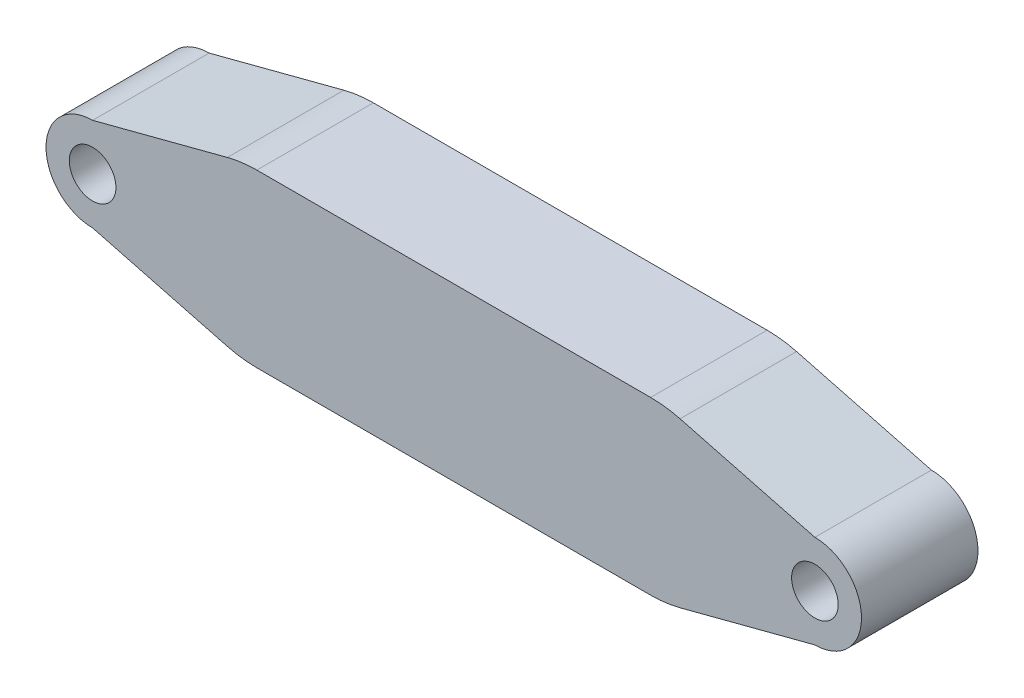
ISO-10303-21;
HEADER;
FILE_DESCRIPTION(('STEP AP214'),'2;1');
FILE_NAME('part.step','',(''),(''),'','','');
FILE_SCHEMA(('AUTOMOTIVE_DESIGN { 1 0 10303 214 1 1 1 1 }'));
ENDSEC;
DATA;
#1=APPLICATION_CONTEXT('core data for automotive mechanical design processes');
#2=APPLICATION_PROTOCOL_DEFINITION('international standard','automotive_design',2000,#1);
#3=PRODUCT_CONTEXT('',#1,'mechanical');
#4=PRODUCT('Part','Part','',(#3));
#5=PRODUCT_RELATED_PRODUCT_CATEGORY('part','',(#4));
#6=PRODUCT_DEFINITION_FORMATION('','',#4);
#7=PRODUCT_DEFINITION_CONTEXT('part definition',#1,'design');
#8=PRODUCT_DEFINITION('design','',#6,#7);
#9=PRODUCT_DEFINITION_SHAPE('','',#8);
#10=(LENGTH_UNIT() NAMED_UNIT(*) SI_UNIT(.MILLI.,.METRE.));
#11=(NAMED_UNIT(*) PLANE_ANGLE_UNIT() SI_UNIT($,.RADIAN.));
#12=(NAMED_UNIT(*) SI_UNIT($,.STERADIAN.) SOLID_ANGLE_UNIT());
#13=UNCERTAINTY_MEASURE_WITH_UNIT(LENGTH_MEASURE(1.E-05),#10,'distance_accuracy_value','');
#14=(GEOMETRIC_REPRESENTATION_CONTEXT(3) GLOBAL_UNCERTAINTY_ASSIGNED_CONTEXT((#13)) GLOBAL_UNIT_ASSIGNED_CONTEXT((#10,
#11,#12)) REPRESENTATION_CONTEXT('',''));
#15=CARTESIAN_POINT('',(0.,0.,0.));
#16=DIRECTION('',(0.,0.,1.));
#17=DIRECTION('',(1.,0.,0.));
#18=AXIS2_PLACEMENT_3D('',#15,#16,#17);
#19=CARTESIAN_POINT('',(62.,0.,10.));
#20=DIRECTION('',(0.,0.,1.));
#21=DIRECTION('',(1.,0.,0.));
#22=AXIS2_PLACEMENT_3D('',#19,#20,#21);
#23=PLANE('',#22);
#24=CARTESIAN_POINT('',(0.,0.,10.));
#25=DIRECTION('',(0.,0.,1.));
#26=DIRECTION('',(1.,0.,0.));
#27=AXIS2_PLACEMENT_3D('',#24,#25,#26);
#28=CIRCLE('',#27,2.);
#29=CARTESIAN_POINT('',(2.,0.,10.));
#30=VERTEX_POINT('',#29);
#31=EDGE_CURVE('E274',#30,#30,#28,.T.);
#32=ORIENTED_EDGE('',*,*,#31,.F.);
#33=EDGE_LOOP('',(#32));
#34=FACE_BOUND('',#33,.T.);
#35=DIRECTION('',(-1.,0.,0.));
#36=VECTOR('',#35,1.);
#37=CARTESIAN_POINT('',(12.815,7.35,10.));
#38=LINE('',#37,#36);
#39=CARTESIAN_POINT('',(47.8995360848553,7.35,10.));
#40=VERTEX_POINT('',#39);
#41=CARTESIAN_POINT('',(14.1004639151447,7.35,10.));
#42=VERTEX_POINT('',#41);
#43=EDGE_CURVE('E254',#40,#42,#38,.T.);
#44=ORIENTED_EDGE('',*,*,#43,.T.);
#45=CARTESIAN_POINT('',(14.1004639151447,-2.65,10.));
#46=DIRECTION('',(0.,0.,1.));
#47=DIRECTION('',(1.,0.,0.));
#48=AXIS2_PLACEMENT_3D('',#45,#46,#47);
#49=CIRCLE('',#48,10.);
#50=CARTESIAN_POINT('',(11.571327969246,7.02488870050518,10.));
#51=VERTEX_POINT('',#50);
#52=EDGE_CURVE('E137',#42,#51,#49,.T.);
#53=ORIENTED_EDGE('',*,*,#52,.T.);
#54=DIRECTION('',(-0.967488870050518,-0.252913594589874,0.));
#55=VECTOR('',#54,1.);
#56=CARTESIAN_POINT('',(0.,4.,10.));
#57=LINE('',#56,#55);
#58=CARTESIAN_POINT('',(0.,4.,10.));
#59=VERTEX_POINT('',#58);
#60=EDGE_CURVE('E129',#51,#59,#57,.T.);
#61=ORIENTED_EDGE('',*,*,#60,.T.);
#62=CARTESIAN_POINT('',(0.,0.,10.));
#63=DIRECTION('',(0.,0.,1.));
#64=DIRECTION('',(1.,0.,0.));
#65=AXIS2_PLACEMENT_3D('',#62,#63,#64);
#66=CIRCLE('',#65,4.);
#67=CARTESIAN_POINT('',(0.,-4.,10.));
#68=VERTEX_POINT('',#67);
#69=EDGE_CURVE('E134',#59,#68,#66,.T.);
#70=ORIENTED_EDGE('',*,*,#69,.T.);
#71=DIRECTION('',(0.967488870050518,-0.252913594589874,0.));
#72=VECTOR('',#71,1.);
#73=CARTESIAN_POINT('',(0.,-4.,10.));
#74=LINE('',#73,#72);
#75=CARTESIAN_POINT('',(11.5713279692459,-7.02488870050518,10.));
#76=VERTEX_POINT('',#75);
#77=EDGE_CURVE('E153',#68,#76,#74,.T.);
#78=ORIENTED_EDGE('',*,*,#77,.T.);
#79=CARTESIAN_POINT('',(14.1004639151447,2.65,10.));
#80=DIRECTION('',(0.,0.,1.));
#81=DIRECTION('',(1.,0.,0.));
#82=AXIS2_PLACEMENT_3D('',#79,#80,#81);
#83=CIRCLE('',#82,10.);
#84=CARTESIAN_POINT('',(14.1004639151447,-7.35,10.));
#85=VERTEX_POINT('',#84);
#86=EDGE_CURVE('E188',#76,#85,#83,.T.);
#87=ORIENTED_EDGE('',*,*,#86,.T.);
#88=DIRECTION('',(1.,0.,0.));
#89=VECTOR('',#88,1.);
#90=CARTESIAN_POINT('',(12.815,-7.35,10.));
#91=LINE('',#90,#89);
#92=CARTESIAN_POINT('',(47.8995360848553,-7.35,10.));
#93=VERTEX_POINT('',#92);
#94=EDGE_CURVE('E213',#85,#93,#91,.T.);
#95=ORIENTED_EDGE('',*,*,#94,.T.);
#96=CARTESIAN_POINT('',(47.8995360848553,2.65,10.));
#97=DIRECTION('',(0.,0.,1.));
#98=DIRECTION('',(1.,0.,0.));
#99=AXIS2_PLACEMENT_3D('',#96,#97,#98);
#100=CIRCLE('',#99,10.);
#101=CARTESIAN_POINT('',(50.428672030754,-7.02488870050519,10.));
#102=VERTEX_POINT('',#101);
#103=EDGE_CURVE('E63',#93,#102,#100,.T.);
#104=ORIENTED_EDGE('',*,*,#103,.T.);
#105=DIRECTION('',(0.967488870050519,0.252913594589874,0.));
#106=VECTOR('',#105,1.);
#107=CARTESIAN_POINT('',(49.185,-7.35,10.));
#108=LINE('',#107,#106);
#109=CARTESIAN_POINT('',(62.,-4.00000000000001,10.));
#110=VERTEX_POINT('',#109);
#111=EDGE_CURVE('E220',#102,#110,#108,.T.);
#112=ORIENTED_EDGE('',*,*,#111,.T.);
#113=CARTESIAN_POINT('',(62.,0.,10.));
#114=DIRECTION('',(0.,0.,1.));
#115=DIRECTION('',(1.,0.,0.));
#116=AXIS2_PLACEMENT_3D('',#113,#114,#115);
#117=CIRCLE('',#116,4.00000000000001);
#118=CARTESIAN_POINT('',(62.,4.00000000000001,10.));
#119=VERTEX_POINT('',#118);
#120=EDGE_CURVE('E260',#110,#119,#117,.T.);
#121=ORIENTED_EDGE('',*,*,#120,.T.);
#122=DIRECTION('',(-0.967488870050519,0.252913594589874,0.));
#123=VECTOR('',#122,1.);
#124=CARTESIAN_POINT('',(49.185,7.35,10.));
#125=LINE('',#124,#123);
#126=CARTESIAN_POINT('',(50.428672030754,7.02488870050519,10.));
#127=VERTEX_POINT('',#126);
#128=EDGE_CURVE('E262',#119,#127,#125,.T.);
#129=ORIENTED_EDGE('',*,*,#128,.T.);
#130=CARTESIAN_POINT('',(47.8995360848553,-2.65,10.));
#131=DIRECTION('',(0.,0.,1.));
#132=DIRECTION('',(1.,0.,0.));
#133=AXIS2_PLACEMENT_3D('',#130,#131,#132);
#134=CIRCLE('',#133,10.);
#135=EDGE_CURVE('E193',#127,#40,#134,.T.);
#136=ORIENTED_EDGE('',*,*,#135,.T.);
#137=EDGE_LOOP('',(#44,#53,#61,#70,#78,#87,#95,#104,#112,#121,#129,#136));
#138=FACE_BOUND('',#137,.T.);
#139=CARTESIAN_POINT('',(62.,0.,10.));
#140=DIRECTION('',(0.,0.,1.));
#141=DIRECTION('',(1.,0.,0.));
#142=AXIS2_PLACEMENT_3D('',#139,#140,#141);
#143=CIRCLE('',#142,2.);
#144=CARTESIAN_POINT('',(64.,0.,10.));
#145=VERTEX_POINT('',#144);
#146=EDGE_CURVE('E433',#145,#145,#143,.T.);
#147=ORIENTED_EDGE('',*,*,#146,.F.);
#148=EDGE_LOOP('',(#147));
#149=FACE_BOUND('',#148,.T.);
#150=ADVANCED_FACE('F39',(#34,#138,#149),#23,.T.);
#151=CARTESIAN_POINT('',(62.,0.,0.));
#152=DIRECTION('',(0.,0.,1.));
#153=DIRECTION('',(1.,0.,0.));
#154=AXIS2_PLACEMENT_3D('',#151,#152,#153);
#155=PLANE('',#154);
#156=DIRECTION('',(-0.967488870050518,-0.252913594589874,0.));
#157=VECTOR('',#156,1.);
#158=CARTESIAN_POINT('',(0.,4.,0.));
#159=LINE('',#158,#157);
#160=CARTESIAN_POINT('',(11.571327969246,7.02488870050518,0.));
#161=VERTEX_POINT('',#160);
#162=CARTESIAN_POINT('',(0.,4.,0.));
#163=VERTEX_POINT('',#162);
#164=EDGE_CURVE('E157',#161,#163,#159,.T.);
#165=ORIENTED_EDGE('',*,*,#164,.F.);
#166=CARTESIAN_POINT('',(14.1004639151447,-2.65,0.));
#167=DIRECTION('',(0.,0.,1.));
#168=DIRECTION('',(1.,0.,0.));
#169=AXIS2_PLACEMENT_3D('',#166,#167,#168);
#170=CIRCLE('',#169,10.);
#171=CARTESIAN_POINT('',(14.1004639151447,7.35,0.));
#172=VERTEX_POINT('',#171);
#173=EDGE_CURVE('E178',#161,#172,#170,.F.);
#174=ORIENTED_EDGE('',*,*,#173,.T.);
#175=DIRECTION('',(-1.,0.,0.));
#176=VECTOR('',#175,1.);
#177=CARTESIAN_POINT('',(12.815,7.35,0.));
#178=LINE('',#177,#176);
#179=CARTESIAN_POINT('',(47.8995360848553,7.35,0.));
#180=VERTEX_POINT('',#179);
#181=EDGE_CURVE('E143',#180,#172,#178,.T.);
#182=ORIENTED_EDGE('',*,*,#181,.F.);
#183=CARTESIAN_POINT('',(47.8995360848553,-2.65,0.));
#184=DIRECTION('',(0.,0.,1.));
#185=DIRECTION('',(1.,0.,0.));
#186=AXIS2_PLACEMENT_3D('',#183,#184,#185);
#187=CIRCLE('',#186,10.);
#188=CARTESIAN_POINT('',(50.428672030754,7.02488870050519,0.));
#189=VERTEX_POINT('',#188);
#190=EDGE_CURVE('E175',#180,#189,#187,.F.);
#191=ORIENTED_EDGE('',*,*,#190,.T.);
#192=DIRECTION('',(-0.967488870050519,0.252913594589874,0.));
#193=VECTOR('',#192,1.);
#194=CARTESIAN_POINT('',(49.185,7.35,0.));
#195=LINE('',#194,#193);
#196=CARTESIAN_POINT('',(62.,4.00000000000001,0.));
#197=VERTEX_POINT('',#196);
#198=EDGE_CURVE('E240',#197,#189,#195,.T.);
#199=ORIENTED_EDGE('',*,*,#198,.F.);
#200=CARTESIAN_POINT('',(62.,0.,0.));
#201=DIRECTION('',(0.,0.,1.));
#202=DIRECTION('',(1.,0.,0.));
#203=AXIS2_PLACEMENT_3D('',#200,#201,#202);
#204=CIRCLE('',#203,4.00000000000001);
#205=CARTESIAN_POINT('',(62.,-4.00000000000001,0.));
#206=VERTEX_POINT('',#205);
#207=EDGE_CURVE('E235',#206,#197,#204,.T.);
#208=ORIENTED_EDGE('',*,*,#207,.F.);
#209=DIRECTION('',(0.967488870050519,0.252913594589874,0.));
#210=VECTOR('',#209,1.);
#211=CARTESIAN_POINT('',(49.185,-7.35,0.));
#212=LINE('',#211,#210);
#213=CARTESIAN_POINT('',(50.428672030754,-7.02488870050519,0.));
#214=VERTEX_POINT('',#213);
#215=EDGE_CURVE('E228',#214,#206,#212,.T.);
#216=ORIENTED_EDGE('',*,*,#215,.F.);
#217=CARTESIAN_POINT('',(47.8995360848553,2.65,0.));
#218=DIRECTION('',(0.,0.,1.));
#219=DIRECTION('',(1.,0.,0.));
#220=AXIS2_PLACEMENT_3D('',#217,#218,#219);
#221=CIRCLE('',#220,10.);
#222=CARTESIAN_POINT('',(47.8995360848553,-7.35,0.));
#223=VERTEX_POINT('',#222);
#224=EDGE_CURVE('E172',#214,#223,#221,.F.);
#225=ORIENTED_EDGE('',*,*,#224,.T.);
#226=DIRECTION('',(1.,0.,0.));
#227=VECTOR('',#226,1.);
#228=CARTESIAN_POINT('',(12.815,-7.35,0.));
#229=LINE('',#228,#227);
#230=CARTESIAN_POINT('',(14.1004639151447,-7.35,0.));
#231=VERTEX_POINT('',#230);
#232=EDGE_CURVE('E216',#231,#223,#229,.T.);
#233=ORIENTED_EDGE('',*,*,#232,.F.);
#234=CARTESIAN_POINT('',(14.1004639151447,2.65,0.));
#235=DIRECTION('',(0.,0.,1.));
#236=DIRECTION('',(1.,0.,0.));
#237=AXIS2_PLACEMENT_3D('',#234,#235,#236);
#238=CIRCLE('',#237,10.);
#239=CARTESIAN_POINT('',(11.5713279692459,-7.02488870050518,0.));
#240=VERTEX_POINT('',#239);
#241=EDGE_CURVE('E164',#231,#240,#238,.F.);
#242=ORIENTED_EDGE('',*,*,#241,.T.);
#243=DIRECTION('',(0.967488870050518,-0.252913594589874,0.));
#244=VECTOR('',#243,1.);
#245=CARTESIAN_POINT('',(0.,-4.,0.));
#246=LINE('',#245,#244);
#247=CARTESIAN_POINT('',(0.,-4.,0.));
#248=VERTEX_POINT('',#247);
#249=EDGE_CURVE('E242',#248,#240,#246,.T.);
#250=ORIENTED_EDGE('',*,*,#249,.F.);
#251=CARTESIAN_POINT('',(0.,0.,0.));
#252=DIRECTION('',(0.,0.,1.));
#253=DIRECTION('',(1.,0.,0.));
#254=AXIS2_PLACEMENT_3D('',#251,#252,#253);
#255=CIRCLE('',#254,4.);
#256=EDGE_CURVE('E273',#163,#248,#255,.T.);
#257=ORIENTED_EDGE('',*,*,#256,.F.);
#258=EDGE_LOOP('',(#165,#174,#182,#191,#199,#208,#216,#225,#233,#242,#250,#257));
#259=FACE_BOUND('',#258,.T.);
#260=CARTESIAN_POINT('',(0.,0.,0.));
#261=DIRECTION('',(0.,0.,1.));
#262=DIRECTION('',(1.,0.,0.));
#263=AXIS2_PLACEMENT_3D('',#260,#261,#262);
#264=CIRCLE('',#263,2.);
#265=CARTESIAN_POINT('',(2.,0.,0.));
#266=VERTEX_POINT('',#265);
#267=EDGE_CURVE('E431',#266,#266,#264,.T.);
#268=ORIENTED_EDGE('',*,*,#267,.T.);
#269=EDGE_LOOP('',(#268));
#270=FACE_BOUND('',#269,.T.);
#271=CARTESIAN_POINT('',(62.,0.,0.));
#272=DIRECTION('',(0.,0.,1.));
#273=DIRECTION('',(1.,0.,0.));
#274=AXIS2_PLACEMENT_3D('',#271,#272,#273);
#275=CIRCLE('',#274,2.);
#276=CARTESIAN_POINT('',(64.,0.,0.));
#277=VERTEX_POINT('',#276);
#278=EDGE_CURVE('E439',#277,#277,#275,.T.);
#279=ORIENTED_EDGE('',*,*,#278,.T.);
#280=EDGE_LOOP('',(#279));
#281=FACE_BOUND('',#280,.T.);
#282=ADVANCED_FACE('F232',(#259,#270,#281),#155,.F.);
#283=CARTESIAN_POINT('',(0.,4.,10.));
#284=DIRECTION('',(0.252913594589874,-0.967488870050518,0.));
#285=DIRECTION('',(0.967488870050518,0.252913594589874,0.));
#286=AXIS2_PLACEMENT_3D('',#283,#284,#285);
#287=PLANE('',#286);
#288=ORIENTED_EDGE('',*,*,#60,.F.);
#289=DIRECTION('',(0.,0.,-1.));
#290=VECTOR('',#289,1.);
#291=CARTESIAN_POINT('',(11.571327969246,7.02488870050518,10.));
#292=LINE('',#291,#290);
#293=EDGE_CURVE('E160',#51,#161,#292,.T.);
#294=ORIENTED_EDGE('',*,*,#293,.T.);
#295=ORIENTED_EDGE('',*,*,#164,.T.);
#296=DIRECTION('',(0.,0.,-1.));
#297=VECTOR('',#296,1.);
#298=CARTESIAN_POINT('',(0.,4.,10.));
#299=LINE('',#298,#297);
#300=EDGE_CURVE('E148',#59,#163,#299,.T.);
#301=ORIENTED_EDGE('',*,*,#300,.F.);
#302=EDGE_LOOP('',(#288,#294,#295,#301));
#303=FACE_BOUND('',#302,.T.);
#304=ADVANCED_FACE('F155',(#303),#287,.F.);
#305=CARTESIAN_POINT('',(0.,0.,10.));
#306=DIRECTION('',(0.,0.,-1.));
#307=DIRECTION('',(-1.,0.,0.));
#308=AXIS2_PLACEMENT_3D('',#305,#306,#307);
#309=CYLINDRICAL_SURFACE('',#308,4.);
#310=ORIENTED_EDGE('',*,*,#256,.T.);
#311=DIRECTION('',(0.,0.,-1.));
#312=VECTOR('',#311,1.);
#313=CARTESIAN_POINT('',(0.,-4.,10.));
#314=LINE('',#313,#312);
#315=EDGE_CURVE('E150',#68,#248,#314,.T.);
#316=ORIENTED_EDGE('',*,*,#315,.F.);
#317=ORIENTED_EDGE('',*,*,#69,.F.);
#318=ORIENTED_EDGE('',*,*,#300,.T.);
#319=EDGE_LOOP('',(#310,#316,#317,#318));
#320=FACE_BOUND('',#319,.T.);
#321=ADVANCED_FACE('F147',(#320),#309,.T.);
#322=CARTESIAN_POINT('',(0.,-4.,10.));
#323=DIRECTION('',(0.252913594589874,0.967488870050518,0.));
#324=DIRECTION('',(-0.967488870050518,0.252913594589874,0.));
#325=AXIS2_PLACEMENT_3D('',#322,#323,#324);
#326=PLANE('',#325);
#327=ORIENTED_EDGE('',*,*,#249,.T.);
#328=DIRECTION('',(0.,0.,-1.));
#329=VECTOR('',#328,1.);
#330=CARTESIAN_POINT('',(11.571327969246,-7.02488870050518,10.));
#331=LINE('',#330,#329);
#332=EDGE_CURVE('E11',#240,#76,#331,.F.);
#333=ORIENTED_EDGE('',*,*,#332,.T.);
#334=ORIENTED_EDGE('',*,*,#77,.F.);
#335=ORIENTED_EDGE('',*,*,#315,.T.);
#336=EDGE_LOOP('',(#327,#333,#334,#335));
#337=FACE_BOUND('',#336,.T.);
#338=ADVANCED_FACE('F281',(#337),#326,.F.);
#339=CARTESIAN_POINT('',(12.815,-7.35,10.));
#340=DIRECTION('',(0.,1.,0.));
#341=DIRECTION('',(0.,0.,1.));
#342=AXIS2_PLACEMENT_3D('',#339,#340,#341);
#343=PLANE('',#342);
#344=ORIENTED_EDGE('',*,*,#232,.T.);
#345=DIRECTION('',(0.,0.,-1.));
#346=VECTOR('',#345,1.);
#347=CARTESIAN_POINT('',(47.8995360848553,-7.35,10.));
#348=LINE('',#347,#346);
#349=EDGE_CURVE('E48',#223,#93,#348,.F.);
#350=ORIENTED_EDGE('',*,*,#349,.T.);
#351=ORIENTED_EDGE('',*,*,#94,.F.);
#352=DIRECTION('',(0.,0.,-1.));
#353=VECTOR('',#352,1.);
#354=CARTESIAN_POINT('',(14.1004639151447,-7.35,10.));
#355=LINE('',#354,#353);
#356=EDGE_CURVE('E204',#85,#231,#355,.T.);
#357=ORIENTED_EDGE('',*,*,#356,.T.);
#358=EDGE_LOOP('',(#344,#350,#351,#357));
#359=FACE_BOUND('',#358,.T.);
#360=ADVANCED_FACE('F212',(#359),#343,.F.);
#361=CARTESIAN_POINT('',(49.185,-7.35,10.));
#362=DIRECTION('',(-0.252913594589874,0.967488870050519,0.));
#363=DIRECTION('',(-0.967488870050519,-0.252913594589874,0.));
#364=AXIS2_PLACEMENT_3D('',#361,#362,#363);
#365=PLANE('',#364);
#366=ORIENTED_EDGE('',*,*,#111,.F.);
#367=DIRECTION('',(0.,0.,-1.));
#368=VECTOR('',#367,1.);
#369=CARTESIAN_POINT('',(50.428672030754,-7.02488870050519,10.));
#370=LINE('',#369,#368);
#371=EDGE_CURVE('E200',#102,#214,#370,.T.);
#372=ORIENTED_EDGE('',*,*,#371,.T.);
#373=ORIENTED_EDGE('',*,*,#215,.T.);
#374=DIRECTION('',(0.,0.,-1.));
#375=VECTOR('',#374,1.);
#376=CARTESIAN_POINT('',(62.,-4.00000000000001,10.));
#377=LINE('',#376,#375);
#378=EDGE_CURVE('E166',#110,#206,#377,.T.);
#379=ORIENTED_EDGE('',*,*,#378,.F.);
#380=EDGE_LOOP('',(#366,#372,#373,#379));
#381=FACE_BOUND('',#380,.T.);
#382=ADVANCED_FACE('F226',(#381),#365,.F.);
#383=CARTESIAN_POINT('',(62.,0.,10.));
#384=DIRECTION('',(0.,0.,-1.));
#385=DIRECTION('',(-1.,0.,0.));
#386=AXIS2_PLACEMENT_3D('',#383,#384,#385);
#387=CYLINDRICAL_SURFACE('',#386,4.00000000000001);
#388=ORIENTED_EDGE('',*,*,#207,.T.);
#389=DIRECTION('',(0.,0.,-1.));
#390=VECTOR('',#389,1.);
#391=CARTESIAN_POINT('',(62.,4.00000000000001,10.));
#392=LINE('',#391,#390);
#393=EDGE_CURVE('E251',#119,#197,#392,.T.);
#394=ORIENTED_EDGE('',*,*,#393,.F.);
#395=ORIENTED_EDGE('',*,*,#120,.F.);
#396=ORIENTED_EDGE('',*,*,#378,.T.);
#397=EDGE_LOOP('',(#388,#394,#395,#396));
#398=FACE_BOUND('',#397,.T.);
#399=ADVANCED_FACE('F258',(#398),#387,.T.);
#400=CARTESIAN_POINT('',(49.185,7.35,10.));
#401=DIRECTION('',(-0.252913594589874,-0.967488870050519,0.));
#402=DIRECTION('',(0.967488870050519,-0.252913594589874,0.));
#403=AXIS2_PLACEMENT_3D('',#400,#401,#402);
#404=PLANE('',#403);
#405=ORIENTED_EDGE('',*,*,#198,.T.);
#406=DIRECTION('',(0.,0.,-1.));
#407=VECTOR('',#406,1.);
#408=CARTESIAN_POINT('',(50.428672030754,7.02488870050519,10.));
#409=LINE('',#408,#407);
#410=EDGE_CURVE('E55',#189,#127,#409,.F.);
#411=ORIENTED_EDGE('',*,*,#410,.T.);
#412=ORIENTED_EDGE('',*,*,#128,.F.);
#413=ORIENTED_EDGE('',*,*,#393,.T.);
#414=EDGE_LOOP('',(#405,#411,#412,#413));
#415=FACE_BOUND('',#414,.T.);
#416=ADVANCED_FACE('F303',(#415),#404,.F.);
#417=CARTESIAN_POINT('',(12.815,7.35,10.));
#418=DIRECTION('',(0.,-1.,0.));
#419=DIRECTION('',(0.,0.,-1.));
#420=AXIS2_PLACEMENT_3D('',#417,#418,#419);
#421=PLANE('',#420);
#422=ORIENTED_EDGE('',*,*,#181,.T.);
#423=DIRECTION('',(0.,0.,-1.));
#424=VECTOR('',#423,1.);
#425=CARTESIAN_POINT('',(14.1004639151447,7.35,10.));
#426=LINE('',#425,#424);
#427=EDGE_CURVE('E185',#172,#42,#426,.F.);
#428=ORIENTED_EDGE('',*,*,#427,.T.);
#429=ORIENTED_EDGE('',*,*,#43,.F.);
#430=DIRECTION('',(0.,0.,-1.));
#431=VECTOR('',#430,1.);
#432=CARTESIAN_POINT('',(47.8995360848553,7.35,10.));
#433=LINE('',#432,#431);
#434=EDGE_CURVE('E181',#40,#180,#433,.T.);
#435=ORIENTED_EDGE('',*,*,#434,.T.);
#436=EDGE_LOOP('',(#422,#428,#429,#435));
#437=FACE_BOUND('',#436,.T.);
#438=ADVANCED_FACE('F300',(#437),#421,.F.);
#439=CARTESIAN_POINT('',(0.,0.,10.));
#440=DIRECTION('',(0.,0.,-1.));
#441=DIRECTION('',(-1.,0.,0.));
#442=AXIS2_PLACEMENT_3D('',#439,#440,#441);
#443=CYLINDRICAL_SURFACE('',#442,2.);
#444=ORIENTED_EDGE('',*,*,#31,.T.);
#445=EDGE_LOOP('',(#444));
#446=FACE_BOUND('',#445,.T.);
#447=ORIENTED_EDGE('',*,*,#267,.F.);
#448=EDGE_LOOP('',(#447));
#449=FACE_BOUND('',#448,.T.);
#450=ADVANCED_FACE('F297',(#446,#449),#443,.F.);
#451=CARTESIAN_POINT('',(62.,0.,10.));
#452=DIRECTION('',(0.,0.,-1.));
#453=DIRECTION('',(-1.,0.,0.));
#454=AXIS2_PLACEMENT_3D('',#451,#452,#453);
#455=CYLINDRICAL_SURFACE('',#454,2.);
#456=ORIENTED_EDGE('',*,*,#146,.T.);
#457=EDGE_LOOP('',(#456));
#458=FACE_BOUND('',#457,.T.);
#459=ORIENTED_EDGE('',*,*,#278,.F.);
#460=EDGE_LOOP('',(#459));
#461=FACE_BOUND('',#460,.T.);
#462=ADVANCED_FACE('F322',(#458,#461),#455,.F.);
#463=CARTESIAN_POINT('',(14.1004639151447,-2.65,10.));
#464=DIRECTION('',(0.,0.,-1.));
#465=DIRECTION('',(-1.,0.,0.));
#466=AXIS2_PLACEMENT_3D('',#463,#464,#465);
#467=CYLINDRICAL_SURFACE('',#466,10.);
#468=ORIENTED_EDGE('',*,*,#52,.F.);
#469=ORIENTED_EDGE('',*,*,#427,.F.);
#470=ORIENTED_EDGE('',*,*,#173,.F.);
#471=ORIENTED_EDGE('',*,*,#293,.F.);
#472=EDGE_LOOP('',(#468,#469,#470,#471));
#473=FACE_BOUND('',#472,.T.);
#474=ADVANCED_FACE('F319',(#473),#467,.T.);
#475=CARTESIAN_POINT('',(47.8995360848553,-2.65,10.));
#476=DIRECTION('',(0.,0.,-1.));
#477=DIRECTION('',(-1.,0.,0.));
#478=AXIS2_PLACEMENT_3D('',#475,#476,#477);
#479=CYLINDRICAL_SURFACE('',#478,10.);
#480=ORIENTED_EDGE('',*,*,#135,.F.);
#481=ORIENTED_EDGE('',*,*,#410,.F.);
#482=ORIENTED_EDGE('',*,*,#190,.F.);
#483=ORIENTED_EDGE('',*,*,#434,.F.);
#484=EDGE_LOOP('',(#480,#481,#482,#483));
#485=FACE_BOUND('',#484,.T.);
#486=ADVANCED_FACE('F287',(#485),#479,.T.);
#487=CARTESIAN_POINT('',(47.8995360848553,2.65,10.));
#488=DIRECTION('',(0.,0.,-1.));
#489=DIRECTION('',(-1.,0.,0.));
#490=AXIS2_PLACEMENT_3D('',#487,#488,#489);
#491=CYLINDRICAL_SURFACE('',#490,10.);
#492=ORIENTED_EDGE('',*,*,#103,.F.);
#493=ORIENTED_EDGE('',*,*,#349,.F.);
#494=ORIENTED_EDGE('',*,*,#224,.F.);
#495=ORIENTED_EDGE('',*,*,#371,.F.);
#496=EDGE_LOOP('',(#492,#493,#494,#495));
#497=FACE_BOUND('',#496,.T.);
#498=ADVANCED_FACE('F223',(#497),#491,.T.);
#499=CARTESIAN_POINT('',(14.1004639151447,2.65,10.));
#500=DIRECTION('',(0.,0.,-1.));
#501=DIRECTION('',(-1.,0.,0.));
#502=AXIS2_PLACEMENT_3D('',#499,#500,#501);
#503=CYLINDRICAL_SURFACE('',#502,10.);
#504=ORIENTED_EDGE('',*,*,#86,.F.);
#505=ORIENTED_EDGE('',*,*,#332,.F.);
#506=ORIENTED_EDGE('',*,*,#241,.F.);
#507=ORIENTED_EDGE('',*,*,#356,.F.);
#508=EDGE_LOOP('',(#504,#505,#506,#507));
#509=FACE_BOUND('',#508,.T.);
#510=ADVANCED_FACE('F41',(#509),#503,.T.);
#511=CLOSED_SHELL('',(#150,#282,#304,#321,#338,#360,#382,#399,#416,#438,#450,#462,#474,#486,
#498,#510));
#512=MANIFOLD_SOLID_BREP('B2',#511);
#513=ADVANCED_BREP_SHAPE_REPRESENTATION('',(#18,#512),#14);
#514=SHAPE_DEFINITION_REPRESENTATION(#9,#513);
ENDSEC;
END-ISO-10303-21;
